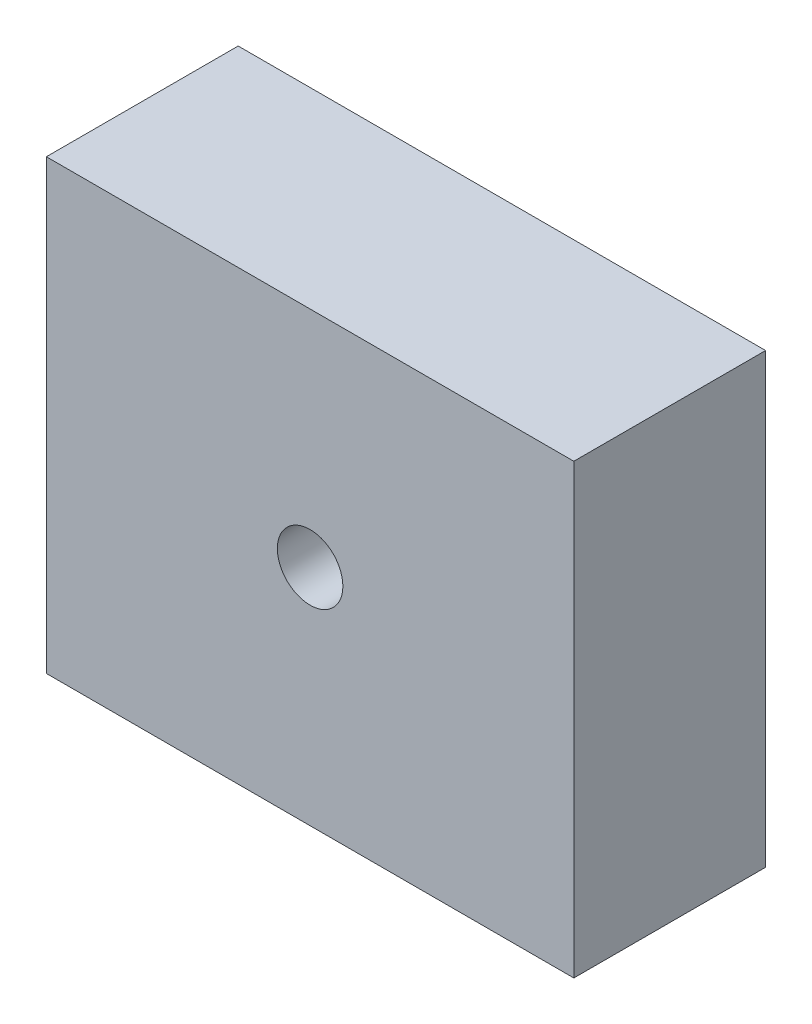
ISO-10303-21;
HEADER;
FILE_DESCRIPTION(('STEP AP214'),'2;1');
FILE_NAME('part.step','',(''),(''),'','','');
FILE_SCHEMA(('AUTOMOTIVE_DESIGN { 1 0 10303 214 1 1 1 1 }'));
ENDSEC;
DATA;
#1=APPLICATION_CONTEXT('core data for automotive mechanical design processes');
#2=APPLICATION_PROTOCOL_DEFINITION('international standard','automotive_design',2000,#1);
#3=PRODUCT_CONTEXT('',#1,'mechanical');
#4=PRODUCT('Part','Part','',(#3));
#5=PRODUCT_RELATED_PRODUCT_CATEGORY('part','',(#4));
#6=PRODUCT_DEFINITION_FORMATION('','',#4);
#7=PRODUCT_DEFINITION_CONTEXT('part definition',#1,'design');
#8=PRODUCT_DEFINITION('design','',#6,#7);
#9=PRODUCT_DEFINITION_SHAPE('','',#8);
#10=(LENGTH_UNIT() NAMED_UNIT(*) SI_UNIT(.MILLI.,.METRE.));
#11=(NAMED_UNIT(*) PLANE_ANGLE_UNIT() SI_UNIT($,.RADIAN.));
#12=(NAMED_UNIT(*) SI_UNIT($,.STERADIAN.) SOLID_ANGLE_UNIT());
#13=UNCERTAINTY_MEASURE_WITH_UNIT(LENGTH_MEASURE(1.E-05),#10,'distance_accuracy_value','');
#14=(GEOMETRIC_REPRESENTATION_CONTEXT(3) GLOBAL_UNCERTAINTY_ASSIGNED_CONTEXT((#13)) GLOBAL_UNIT_ASSIGNED_CONTEXT((#10,
#11,#12)) REPRESENTATION_CONTEXT('',''));
#15=CARTESIAN_POINT('',(0.,0.,0.));
#16=DIRECTION('',(0.,0.,1.));
#17=DIRECTION('',(1.,0.,0.));
#18=AXIS2_PLACEMENT_3D('',#15,#16,#17);
#19=CARTESIAN_POINT('',(0.,0.,24.));
#20=DIRECTION('',(0.,0.,1.));
#21=DIRECTION('',(1.,0.,0.));
#22=AXIS2_PLACEMENT_3D('',#19,#20,#21);
#23=PLANE('',#22);
#24=DIRECTION('',(0.,-1.,0.));
#25=VECTOR('',#24,1.);
#26=CARTESIAN_POINT('',(-33.,28.,24.));
#27=LINE('',#26,#25);
#28=CARTESIAN_POINT('',(-33.,28.,24.));
#29=VERTEX_POINT('',#28);
#30=CARTESIAN_POINT('',(-33.,-28.,24.));
#31=VERTEX_POINT('',#30);
#32=EDGE_CURVE('E93',#29,#31,#27,.T.);
#33=ORIENTED_EDGE('',*,*,#32,.T.);
#34=DIRECTION('',(1.,0.,0.));
#35=VECTOR('',#34,1.);
#36=CARTESIAN_POINT('',(-33.,-28.,24.));
#37=LINE('',#36,#35);
#38=CARTESIAN_POINT('',(33.,-28.,24.));
#39=VERTEX_POINT('',#38);
#40=EDGE_CURVE('E88',#31,#39,#37,.T.);
#41=ORIENTED_EDGE('',*,*,#40,.T.);
#42=DIRECTION('',(0.,1.,0.));
#43=VECTOR('',#42,1.);
#44=CARTESIAN_POINT('',(33.,-28.,24.));
#45=LINE('',#44,#43);
#46=CARTESIAN_POINT('',(33.,28.,24.));
#47=VERTEX_POINT('',#46);
#48=EDGE_CURVE('E91',#39,#47,#45,.T.);
#49=ORIENTED_EDGE('',*,*,#48,.T.);
#50=DIRECTION('',(-1.,0.,0.));
#51=VECTOR('',#50,1.);
#52=CARTESIAN_POINT('',(33.,28.,24.));
#53=LINE('',#52,#51);
#54=EDGE_CURVE('E58',#47,#29,#53,.T.);
#55=ORIENTED_EDGE('',*,*,#54,.T.);
#56=EDGE_LOOP('',(#33,#41,#49,#55));
#57=FACE_BOUND('',#56,.T.);
#58=CARTESIAN_POINT('',(0.,0.,24.));
#59=DIRECTION('',(0.,0.,1.));
#60=DIRECTION('',(1.,0.,0.));
#61=AXIS2_PLACEMENT_3D('',#58,#59,#60);
#62=CIRCLE('',#61,4.1);
#63=CARTESIAN_POINT('',(4.1,0.,24.));
#64=VERTEX_POINT('',#63);
#65=EDGE_CURVE('E108',#64,#64,#62,.T.);
#66=ORIENTED_EDGE('',*,*,#65,.F.);
#67=EDGE_LOOP('',(#66));
#68=FACE_BOUND('',#67,.T.);
#69=ADVANCED_FACE('F41',(#57,#68),#23,.T.);
#70=CARTESIAN_POINT('',(0.,0.,0.));
#71=DIRECTION('',(0.,0.,1.));
#72=DIRECTION('',(1.,0.,0.));
#73=AXIS2_PLACEMENT_3D('',#70,#71,#72);
#74=PLANE('',#73);
#75=DIRECTION('',(0.,-1.,0.));
#76=VECTOR('',#75,1.);
#77=CARTESIAN_POINT('',(-33.,28.,0.));
#78=LINE('',#77,#76);
#79=CARTESIAN_POINT('',(-33.,28.,0.));
#80=VERTEX_POINT('',#79);
#81=CARTESIAN_POINT('',(-33.,-28.,0.));
#82=VERTEX_POINT('',#81);
#83=EDGE_CURVE('E105',#80,#82,#78,.T.);
#84=ORIENTED_EDGE('',*,*,#83,.F.);
#85=DIRECTION('',(-1.,0.,0.));
#86=VECTOR('',#85,1.);
#87=CARTESIAN_POINT('',(33.,28.,0.));
#88=LINE('',#87,#86);
#89=CARTESIAN_POINT('',(33.,28.,0.));
#90=VERTEX_POINT('',#89);
#91=EDGE_CURVE('E81',#90,#80,#88,.T.);
#92=ORIENTED_EDGE('',*,*,#91,.F.);
#93=DIRECTION('',(0.,1.,0.));
#94=VECTOR('',#93,1.);
#95=CARTESIAN_POINT('',(33.,-28.,0.));
#96=LINE('',#95,#94);
#97=CARTESIAN_POINT('',(33.,-28.,0.));
#98=VERTEX_POINT('',#97);
#99=EDGE_CURVE('E75',#98,#90,#96,.T.);
#100=ORIENTED_EDGE('',*,*,#99,.F.);
#101=DIRECTION('',(1.,0.,0.));
#102=VECTOR('',#101,1.);
#103=CARTESIAN_POINT('',(-33.,-28.,0.));
#104=LINE('',#103,#102);
#105=EDGE_CURVE('E97',#82,#98,#104,.T.);
#106=ORIENTED_EDGE('',*,*,#105,.F.);
#107=EDGE_LOOP('',(#84,#92,#100,#106));
#108=FACE_BOUND('',#107,.T.);
#109=CARTESIAN_POINT('',(0.,0.,0.));
#110=DIRECTION('',(0.,0.,1.));
#111=DIRECTION('',(1.,0.,0.));
#112=AXIS2_PLACEMENT_3D('',#109,#110,#111);
#113=CIRCLE('',#112,4.1);
#114=CARTESIAN_POINT('',(4.1,0.,0.));
#115=VERTEX_POINT('',#114);
#116=EDGE_CURVE('E120',#115,#115,#113,.T.);
#117=ORIENTED_EDGE('',*,*,#116,.T.);
#118=EDGE_LOOP('',(#117));
#119=FACE_BOUND('',#118,.T.);
#120=ADVANCED_FACE('F116',(#108,#119),#74,.F.);
#121=CARTESIAN_POINT('',(-33.,28.,24.));
#122=DIRECTION('',(1.,0.,0.));
#123=DIRECTION('',(0.,0.,-1.));
#124=AXIS2_PLACEMENT_3D('',#121,#122,#123);
#125=PLANE('',#124);
#126=ORIENTED_EDGE('',*,*,#83,.T.);
#127=DIRECTION('',(0.,0.,-1.));
#128=VECTOR('',#127,1.);
#129=CARTESIAN_POINT('',(-33.,-28.,24.));
#130=LINE('',#129,#128);
#131=EDGE_CURVE('E11',#31,#82,#130,.T.);
#132=ORIENTED_EDGE('',*,*,#131,.F.);
#133=ORIENTED_EDGE('',*,*,#32,.F.);
#134=DIRECTION('',(0.,0.,-1.));
#135=VECTOR('',#134,1.);
#136=CARTESIAN_POINT('',(-33.,28.,24.));
#137=LINE('',#136,#135);
#138=EDGE_CURVE('E101',#29,#80,#137,.T.);
#139=ORIENTED_EDGE('',*,*,#138,.T.);
#140=EDGE_LOOP('',(#126,#132,#133,#139));
#141=FACE_BOUND('',#140,.T.);
#142=ADVANCED_FACE('F43',(#141),#125,.F.);
#143=CARTESIAN_POINT('',(-33.,-28.,24.));
#144=DIRECTION('',(0.,1.,0.));
#145=DIRECTION('',(0.,0.,1.));
#146=AXIS2_PLACEMENT_3D('',#143,#144,#145);
#147=PLANE('',#146);
#148=ORIENTED_EDGE('',*,*,#105,.T.);
#149=DIRECTION('',(0.,0.,-1.));
#150=VECTOR('',#149,1.);
#151=CARTESIAN_POINT('',(33.,-28.,24.));
#152=LINE('',#151,#150);
#153=EDGE_CURVE('E50',#39,#98,#152,.T.);
#154=ORIENTED_EDGE('',*,*,#153,.F.);
#155=ORIENTED_EDGE('',*,*,#40,.F.);
#156=ORIENTED_EDGE('',*,*,#131,.T.);
#157=EDGE_LOOP('',(#148,#154,#155,#156));
#158=FACE_BOUND('',#157,.T.);
#159=ADVANCED_FACE('F96',(#158),#147,.F.);
#160=CARTESIAN_POINT('',(33.,-28.,24.));
#161=DIRECTION('',(-1.,0.,0.));
#162=DIRECTION('',(0.,0.,1.));
#163=AXIS2_PLACEMENT_3D('',#160,#161,#162);
#164=PLANE('',#163);
#165=ORIENTED_EDGE('',*,*,#99,.T.);
#166=DIRECTION('',(0.,0.,-1.));
#167=VECTOR('',#166,1.);
#168=CARTESIAN_POINT('',(33.,28.,24.));
#169=LINE('',#168,#167);
#170=EDGE_CURVE('E98',#47,#90,#169,.T.);
#171=ORIENTED_EDGE('',*,*,#170,.F.);
#172=ORIENTED_EDGE('',*,*,#48,.F.);
#173=ORIENTED_EDGE('',*,*,#153,.T.);
#174=EDGE_LOOP('',(#165,#171,#172,#173));
#175=FACE_BOUND('',#174,.T.);
#176=ADVANCED_FACE('F99',(#175),#164,.F.);
#177=CARTESIAN_POINT('',(33.,28.,24.));
#178=DIRECTION('',(0.,-1.,0.));
#179=DIRECTION('',(0.,0.,-1.));
#180=AXIS2_PLACEMENT_3D('',#177,#178,#179);
#181=PLANE('',#180);
#182=ORIENTED_EDGE('',*,*,#91,.T.);
#183=ORIENTED_EDGE('',*,*,#138,.F.);
#184=ORIENTED_EDGE('',*,*,#54,.F.);
#185=ORIENTED_EDGE('',*,*,#170,.T.);
#186=EDGE_LOOP('',(#182,#183,#184,#185));
#187=FACE_BOUND('',#186,.T.);
#188=ADVANCED_FACE('F113',(#187),#181,.F.);
#189=CARTESIAN_POINT('',(0.,0.,24.));
#190=DIRECTION('',(0.,0.,-1.));
#191=DIRECTION('',(-1.,0.,0.));
#192=AXIS2_PLACEMENT_3D('',#189,#190,#191);
#193=CYLINDRICAL_SURFACE('',#192,4.1);
#194=ORIENTED_EDGE('',*,*,#65,.T.);
#195=EDGE_LOOP('',(#194));
#196=FACE_BOUND('',#195,.T.);
#197=ORIENTED_EDGE('',*,*,#116,.F.);
#198=EDGE_LOOP('',(#197));
#199=FACE_BOUND('',#198,.T.);
#200=ADVANCED_FACE('F126',(#196,#199),#193,.F.);
#201=CLOSED_SHELL('',(#69,#120,#142,#159,#176,#188,#200));
#202=MANIFOLD_SOLID_BREP('B2',#201);
#203=ADVANCED_BREP_SHAPE_REPRESENTATION('',(#18,#202),#14);
#204=SHAPE_DEFINITION_REPRESENTATION(#9,#203);
ENDSEC;
END-ISO-10303-21;
